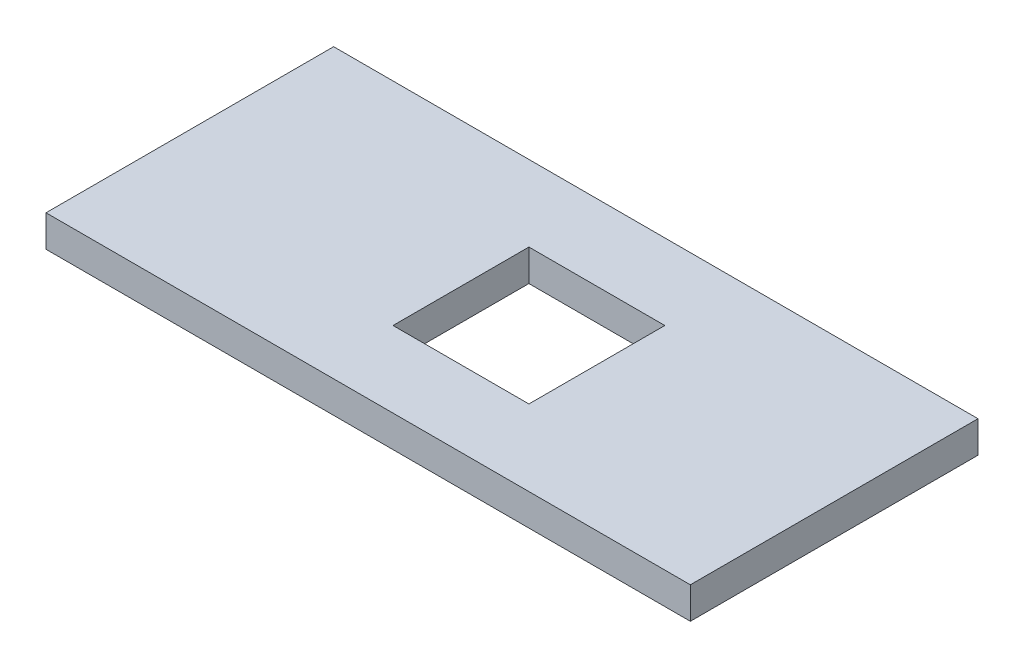
ISO-10303-21;
HEADER;
FILE_DESCRIPTION(('STEP AP214'),'2;1');
FILE_NAME('part.step','',(''),(''),'','','');
FILE_SCHEMA(('AUTOMOTIVE_DESIGN { 1 0 10303 214 1 1 1 1 }'));
ENDSEC;
DATA;
#1=APPLICATION_CONTEXT('core data for automotive mechanical design processes');
#2=APPLICATION_PROTOCOL_DEFINITION('international standard','automotive_design',2000,#1);
#3=PRODUCT_CONTEXT('',#1,'mechanical');
#4=PRODUCT('Part','Part','',(#3));
#5=PRODUCT_RELATED_PRODUCT_CATEGORY('part','',(#4));
#6=PRODUCT_DEFINITION_FORMATION('','',#4);
#7=PRODUCT_DEFINITION_CONTEXT('part definition',#1,'design');
#8=PRODUCT_DEFINITION('design','',#6,#7);
#9=PRODUCT_DEFINITION_SHAPE('','',#8);
#10=(LENGTH_UNIT() NAMED_UNIT(*) SI_UNIT(.MILLI.,.METRE.));
#11=(NAMED_UNIT(*) PLANE_ANGLE_UNIT() SI_UNIT($,.RADIAN.));
#12=(NAMED_UNIT(*) SI_UNIT($,.STERADIAN.) SOLID_ANGLE_UNIT());
#13=UNCERTAINTY_MEASURE_WITH_UNIT(LENGTH_MEASURE(1.E-05),#10,'distance_accuracy_value','');
#14=(GEOMETRIC_REPRESENTATION_CONTEXT(3) GLOBAL_UNCERTAINTY_ASSIGNED_CONTEXT((#13)) GLOBAL_UNIT_ASSIGNED_CONTEXT((#10,
#11,#12)) REPRESENTATION_CONTEXT('',''));
#15=CARTESIAN_POINT('',(0.,0.,0.));
#16=DIRECTION('',(0.,0.,1.));
#17=DIRECTION('',(1.,0.,0.));
#18=AXIS2_PLACEMENT_3D('',#15,#16,#17);
#19=CARTESIAN_POINT('',(142.24,13.97,63.5));
#20=DIRECTION('',(-1.,0.,0.));
#21=DIRECTION('',(0.,0.,1.));
#22=AXIS2_PLACEMENT_3D('',#19,#20,#21);
#23=PLANE('',#22);
#24=DIRECTION('',(0.,0.,-1.));
#25=VECTOR('',#24,1.);
#26=CARTESIAN_POINT('',(142.24,0.,63.5));
#27=LINE('',#26,#25);
#28=CARTESIAN_POINT('',(142.24,0.,63.5));
#29=VERTEX_POINT('',#28);
#30=CARTESIAN_POINT('',(142.24,0.,-63.5));
#31=VERTEX_POINT('',#30);
#32=EDGE_CURVE('E133',#29,#31,#27,.T.);
#33=ORIENTED_EDGE('',*,*,#32,.T.);
#34=DIRECTION('',(0.,-1.,0.));
#35=VECTOR('',#34,1.);
#36=CARTESIAN_POINT('',(142.24,13.97,-63.5));
#37=LINE('',#36,#35);
#38=CARTESIAN_POINT('',(142.24,13.97,-63.5));
#39=VERTEX_POINT('',#38);
#40=EDGE_CURVE('E11',#39,#31,#37,.T.);
#41=ORIENTED_EDGE('',*,*,#40,.F.);
#42=DIRECTION('',(0.,0.,-1.));
#43=VECTOR('',#42,1.);
#44=CARTESIAN_POINT('',(142.24,13.97,63.5));
#45=LINE('',#44,#43);
#46=CARTESIAN_POINT('',(142.24,13.97,63.5));
#47=VERTEX_POINT('',#46);
#48=EDGE_CURVE('E137',#47,#39,#45,.T.);
#49=ORIENTED_EDGE('',*,*,#48,.F.);
#50=DIRECTION('',(0.,-1.,0.));
#51=VECTOR('',#50,1.);
#52=CARTESIAN_POINT('',(142.24,13.97,63.5));
#53=LINE('',#52,#51);
#54=EDGE_CURVE('E147',#47,#29,#53,.T.);
#55=ORIENTED_EDGE('',*,*,#54,.T.);
#56=EDGE_LOOP('',(#33,#41,#49,#55));
#57=FACE_BOUND('',#56,.T.);
#58=ADVANCED_FACE('F38',(#57),#23,.F.);
#59=CARTESIAN_POINT('',(-142.24,13.97,-63.5));
#60=DIRECTION('',(0.,0.,1.));
#61=DIRECTION('',(1.,0.,0.));
#62=AXIS2_PLACEMENT_3D('',#59,#60,#61);
#63=PLANE('',#62);
#64=DIRECTION('',(-1.,0.,0.));
#65=VECTOR('',#64,1.);
#66=CARTESIAN_POINT('',(-142.24,0.,-63.5));
#67=LINE('',#66,#65);
#68=CARTESIAN_POINT('',(-142.24,0.,-63.5));
#69=VERTEX_POINT('',#68);
#70=EDGE_CURVE('E150',#31,#69,#67,.T.);
#71=ORIENTED_EDGE('',*,*,#70,.T.);
#72=DIRECTION('',(0.,-1.,0.));
#73=VECTOR('',#72,1.);
#74=CARTESIAN_POINT('',(-142.24,13.97,-63.5));
#75=LINE('',#74,#73);
#76=CARTESIAN_POINT('',(-142.24,13.97,-63.5));
#77=VERTEX_POINT('',#76);
#78=EDGE_CURVE('E45',#77,#69,#75,.T.);
#79=ORIENTED_EDGE('',*,*,#78,.F.);
#80=DIRECTION('',(-1.,0.,0.));
#81=VECTOR('',#80,1.);
#82=CARTESIAN_POINT('',(-142.24,13.97,-63.5));
#83=LINE('',#82,#81);
#84=EDGE_CURVE('E140',#39,#77,#83,.T.);
#85=ORIENTED_EDGE('',*,*,#84,.F.);
#86=ORIENTED_EDGE('',*,*,#40,.T.);
#87=EDGE_LOOP('',(#71,#79,#85,#86));
#88=FACE_BOUND('',#87,.T.);
#89=ADVANCED_FACE('F178',(#88),#63,.F.);
#90=CARTESIAN_POINT('',(-142.24,13.97,63.5));
#91=DIRECTION('',(1.,0.,0.));
#92=DIRECTION('',(0.,0.,-1.));
#93=AXIS2_PLACEMENT_3D('',#90,#91,#92);
#94=PLANE('',#93);
#95=DIRECTION('',(0.,0.,1.));
#96=VECTOR('',#95,1.);
#97=CARTESIAN_POINT('',(-142.24,0.,63.5));
#98=LINE('',#97,#96);
#99=CARTESIAN_POINT('',(-142.24,0.,63.5));
#100=VERTEX_POINT('',#99);
#101=EDGE_CURVE('E152',#69,#100,#98,.T.);
#102=ORIENTED_EDGE('',*,*,#101,.T.);
#103=DIRECTION('',(0.,-1.,0.));
#104=VECTOR('',#103,1.);
#105=CARTESIAN_POINT('',(-142.24,13.97,63.5));
#106=LINE('',#105,#104);
#107=CARTESIAN_POINT('',(-142.24,13.97,63.5));
#108=VERTEX_POINT('',#107);
#109=EDGE_CURVE('E157',#108,#100,#106,.T.);
#110=ORIENTED_EDGE('',*,*,#109,.F.);
#111=DIRECTION('',(0.,0.,1.));
#112=VECTOR('',#111,1.);
#113=CARTESIAN_POINT('',(-142.24,13.97,63.5));
#114=LINE('',#113,#112);
#115=EDGE_CURVE('E143',#77,#108,#114,.T.);
#116=ORIENTED_EDGE('',*,*,#115,.F.);
#117=ORIENTED_EDGE('',*,*,#78,.T.);
#118=EDGE_LOOP('',(#102,#110,#116,#117));
#119=FACE_BOUND('',#118,.T.);
#120=ADVANCED_FACE('F164',(#119),#94,.F.);
#121=CARTESIAN_POINT('',(-142.24,13.97,63.5));
#122=DIRECTION('',(0.,0.,-1.));
#123=DIRECTION('',(-1.,0.,0.));
#124=AXIS2_PLACEMENT_3D('',#121,#122,#123);
#125=PLANE('',#124);
#126=DIRECTION('',(1.,0.,0.));
#127=VECTOR('',#126,1.);
#128=CARTESIAN_POINT('',(-142.24,0.,63.5));
#129=LINE('',#128,#127);
#130=EDGE_CURVE('E141',#100,#29,#129,.T.);
#131=ORIENTED_EDGE('',*,*,#130,.T.);
#132=ORIENTED_EDGE('',*,*,#54,.F.);
#133=DIRECTION('',(1.,0.,0.));
#134=VECTOR('',#133,1.);
#135=CARTESIAN_POINT('',(-142.24,13.97,63.5));
#136=LINE('',#135,#134);
#137=EDGE_CURVE('E145',#108,#47,#136,.T.);
#138=ORIENTED_EDGE('',*,*,#137,.F.);
#139=ORIENTED_EDGE('',*,*,#109,.T.);
#140=EDGE_LOOP('',(#131,#132,#138,#139));
#141=FACE_BOUND('',#140,.T.);
#142=ADVANCED_FACE('F171',(#141),#125,.F.);
#143=CARTESIAN_POINT('',(0.,13.97,0.));
#144=DIRECTION('',(0.,-1.,0.));
#145=DIRECTION('',(0.,0.,-1.));
#146=AXIS2_PLACEMENT_3D('',#143,#144,#145);
#147=PLANE('',#146);
#148=DIRECTION('',(0.,0.,-1.));
#149=VECTOR('',#148,1.);
#150=CARTESIAN_POINT('',(37.4676,13.97,30.));
#151=LINE('',#150,#149);
#152=CARTESIAN_POINT('',(37.4676,13.97,30.));
#153=VERTEX_POINT('',#152);
#154=CARTESIAN_POINT('',(37.4676,13.97,-30.));
#155=VERTEX_POINT('',#154);
#156=EDGE_CURVE('E127',#153,#155,#151,.T.);
#157=ORIENTED_EDGE('',*,*,#156,.F.);
#158=DIRECTION('',(1.,0.,0.));
#159=VECTOR('',#158,1.);
#160=CARTESIAN_POINT('',(-22.5324,13.97,30.));
#161=LINE('',#160,#159);
#162=CARTESIAN_POINT('',(-22.5324,13.97,30.));
#163=VERTEX_POINT('',#162);
#164=EDGE_CURVE('E52',#163,#153,#161,.T.);
#165=ORIENTED_EDGE('',*,*,#164,.F.);
#166=DIRECTION('',(0.,0.,-1.));
#167=VECTOR('',#166,1.);
#168=CARTESIAN_POINT('',(-22.5324,13.97,30.));
#169=LINE('',#168,#167);
#170=CARTESIAN_POINT('',(-22.5324,13.97,-30.));
#171=VERTEX_POINT('',#170);
#172=EDGE_CURVE('E118',#163,#171,#169,.T.);
#173=ORIENTED_EDGE('',*,*,#172,.T.);
#174=DIRECTION('',(1.,0.,0.));
#175=VECTOR('',#174,1.);
#176=CARTESIAN_POINT('',(-22.5324,13.97,-30.));
#177=LINE('',#176,#175);
#178=EDGE_CURVE('E121',#171,#155,#177,.T.);
#179=ORIENTED_EDGE('',*,*,#178,.T.);
#180=EDGE_LOOP('',(#157,#165,#173,#179));
#181=FACE_BOUND('',#180,.T.);
#182=ORIENTED_EDGE('',*,*,#48,.T.);
#183=ORIENTED_EDGE('',*,*,#84,.T.);
#184=ORIENTED_EDGE('',*,*,#115,.T.);
#185=ORIENTED_EDGE('',*,*,#137,.T.);
#186=EDGE_LOOP('',(#182,#183,#184,#185));
#187=FACE_BOUND('',#186,.T.);
#188=ADVANCED_FACE('F177',(#181,#187),#147,.F.);
#189=CARTESIAN_POINT('',(0.,0.,0.));
#190=DIRECTION('',(0.,-1.,0.));
#191=DIRECTION('',(0.,0.,-1.));
#192=AXIS2_PLACEMENT_3D('',#189,#190,#191);
#193=PLANE('',#192);
#194=DIRECTION('',(1.,0.,0.));
#195=VECTOR('',#194,1.);
#196=CARTESIAN_POINT('',(-22.5324,0.,30.));
#197=LINE('',#196,#195);
#198=CARTESIAN_POINT('',(-22.5324,0.,30.));
#199=VERTEX_POINT('',#198);
#200=CARTESIAN_POINT('',(37.4676,0.,30.));
#201=VERTEX_POINT('',#200);
#202=EDGE_CURVE('E104',#199,#201,#197,.T.);
#203=ORIENTED_EDGE('',*,*,#202,.T.);
#204=DIRECTION('',(0.,0.,-1.));
#205=VECTOR('',#204,1.);
#206=CARTESIAN_POINT('',(37.4676,0.,30.));
#207=LINE('',#206,#205);
#208=CARTESIAN_POINT('',(37.4676,0.,-30.));
#209=VERTEX_POINT('',#208);
#210=EDGE_CURVE('E110',#201,#209,#207,.T.);
#211=ORIENTED_EDGE('',*,*,#210,.T.);
#212=DIRECTION('',(1.,0.,0.));
#213=VECTOR('',#212,1.);
#214=CARTESIAN_POINT('',(-22.5324,0.,-30.));
#215=LINE('',#214,#213);
#216=CARTESIAN_POINT('',(-22.5324,0.,-30.));
#217=VERTEX_POINT('',#216);
#218=EDGE_CURVE('E114',#217,#209,#215,.T.);
#219=ORIENTED_EDGE('',*,*,#218,.F.);
#220=DIRECTION('',(0.,0.,-1.));
#221=VECTOR('',#220,1.);
#222=CARTESIAN_POINT('',(-22.5324,0.,30.));
#223=LINE('',#222,#221);
#224=EDGE_CURVE('E107',#199,#217,#223,.T.);
#225=ORIENTED_EDGE('',*,*,#224,.F.);
#226=EDGE_LOOP('',(#203,#211,#219,#225));
#227=FACE_BOUND('',#226,.T.);
#228=ORIENTED_EDGE('',*,*,#32,.F.);
#229=ORIENTED_EDGE('',*,*,#130,.F.);
#230=ORIENTED_EDGE('',*,*,#101,.F.);
#231=ORIENTED_EDGE('',*,*,#70,.F.);
#232=EDGE_LOOP('',(#228,#229,#230,#231));
#233=FACE_BOUND('',#232,.T.);
#234=ADVANCED_FACE('F116',(#227,#233),#193,.T.);
#235=CARTESIAN_POINT('',(-22.5324,0.,30.));
#236=DIRECTION('',(0.,0.,1.));
#237=DIRECTION('',(1.,0.,0.));
#238=AXIS2_PLACEMENT_3D('',#235,#236,#237);
#239=PLANE('',#238);
#240=ORIENTED_EDGE('',*,*,#164,.T.);
#241=DIRECTION('',(0.,1.,0.));
#242=VECTOR('',#241,1.);
#243=CARTESIAN_POINT('',(37.4676,0.,30.));
#244=LINE('',#243,#242);
#245=EDGE_CURVE('E101',#201,#153,#244,.T.);
#246=ORIENTED_EDGE('',*,*,#245,.F.);
#247=ORIENTED_EDGE('',*,*,#202,.F.);
#248=DIRECTION('',(0.,1.,0.));
#249=VECTOR('',#248,1.);
#250=CARTESIAN_POINT('',(-22.5324,0.,30.));
#251=LINE('',#250,#249);
#252=EDGE_CURVE('E131',#199,#163,#251,.T.);
#253=ORIENTED_EDGE('',*,*,#252,.T.);
#254=EDGE_LOOP('',(#240,#246,#247,#253));
#255=FACE_BOUND('',#254,.T.);
#256=ADVANCED_FACE('F102',(#255),#239,.F.);
#257=CARTESIAN_POINT('',(-22.5324,0.,30.));
#258=DIRECTION('',(1.,0.,0.));
#259=DIRECTION('',(0.,0.,-1.));
#260=AXIS2_PLACEMENT_3D('',#257,#258,#259);
#261=PLANE('',#260);
#262=ORIENTED_EDGE('',*,*,#172,.F.);
#263=ORIENTED_EDGE('',*,*,#252,.F.);
#264=ORIENTED_EDGE('',*,*,#224,.T.);
#265=DIRECTION('',(0.,1.,0.));
#266=VECTOR('',#265,1.);
#267=CARTESIAN_POINT('',(-22.5324,0.,-30.));
#268=LINE('',#267,#266);
#269=EDGE_CURVE('E134',#217,#171,#268,.T.);
#270=ORIENTED_EDGE('',*,*,#269,.T.);
#271=EDGE_LOOP('',(#262,#263,#264,#270));
#272=FACE_BOUND('',#271,.T.);
#273=ADVANCED_FACE('F195',(#272),#261,.T.);
#274=CARTESIAN_POINT('',(-22.5324,0.,-30.));
#275=DIRECTION('',(0.,0.,1.));
#276=DIRECTION('',(1.,0.,0.));
#277=AXIS2_PLACEMENT_3D('',#274,#275,#276);
#278=PLANE('',#277);
#279=ORIENTED_EDGE('',*,*,#178,.F.);
#280=ORIENTED_EDGE('',*,*,#269,.F.);
#281=ORIENTED_EDGE('',*,*,#218,.T.);
#282=DIRECTION('',(0.,1.,0.));
#283=VECTOR('',#282,1.);
#284=CARTESIAN_POINT('',(37.4676,0.,-30.));
#285=LINE('',#284,#283);
#286=EDGE_CURVE('E60',#209,#155,#285,.T.);
#287=ORIENTED_EDGE('',*,*,#286,.T.);
#288=EDGE_LOOP('',(#279,#280,#281,#287));
#289=FACE_BOUND('',#288,.T.);
#290=ADVANCED_FACE('F198',(#289),#278,.T.);
#291=CARTESIAN_POINT('',(37.4676,0.,30.));
#292=DIRECTION('',(1.,0.,0.));
#293=DIRECTION('',(0.,0.,-1.));
#294=AXIS2_PLACEMENT_3D('',#291,#292,#293);
#295=PLANE('',#294);
#296=ORIENTED_EDGE('',*,*,#156,.T.);
#297=ORIENTED_EDGE('',*,*,#286,.F.);
#298=ORIENTED_EDGE('',*,*,#210,.F.);
#299=ORIENTED_EDGE('',*,*,#245,.T.);
#300=EDGE_LOOP('',(#296,#297,#298,#299));
#301=FACE_BOUND('',#300,.T.);
#302=ADVANCED_FACE('F111',(#301),#295,.F.);
#303=CLOSED_SHELL('',(#58,#89,#120,#142,#188,#234,#256,#273,#290,#302));
#304=MANIFOLD_SOLID_BREP('B2',#303);
#305=ADVANCED_BREP_SHAPE_REPRESENTATION('',(#18,#304),#14);
#306=SHAPE_DEFINITION_REPRESENTATION(#9,#305);
ENDSEC;
END-ISO-10303-21;
